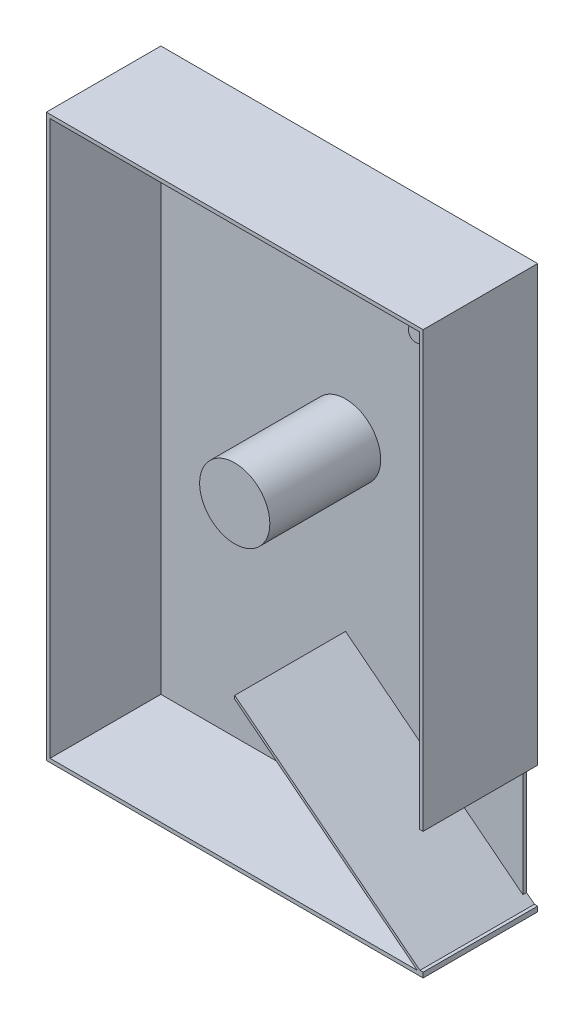
ISO-10303-21;
HEADER;
FILE_DESCRIPTION(('STEP AP214'),'2;1');
FILE_NAME('part.step','',(''),(''),'','','');
FILE_SCHEMA(('AUTOMOTIVE_DESIGN { 1 0 10303 214 1 1 1 1 }'));
ENDSEC;
DATA;
#1=APPLICATION_CONTEXT('core data for automotive mechanical design processes');
#2=APPLICATION_PROTOCOL_DEFINITION('international standard','automotive_design',2000,#1);
#3=PRODUCT_CONTEXT('',#1,'mechanical');
#4=PRODUCT('Part','Part','',(#3));
#5=PRODUCT_RELATED_PRODUCT_CATEGORY('part','',(#4));
#6=PRODUCT_DEFINITION_FORMATION('','',#4);
#7=PRODUCT_DEFINITION_CONTEXT('part definition',#1,'design');
#8=PRODUCT_DEFINITION('design','',#6,#7);
#9=PRODUCT_DEFINITION_SHAPE('','',#8);
#10=(LENGTH_UNIT() NAMED_UNIT(*) SI_UNIT(.MILLI.,.METRE.));
#11=(NAMED_UNIT(*) PLANE_ANGLE_UNIT() SI_UNIT($,.RADIAN.));
#12=(NAMED_UNIT(*) SI_UNIT($,.STERADIAN.) SOLID_ANGLE_UNIT());
#13=UNCERTAINTY_MEASURE_WITH_UNIT(LENGTH_MEASURE(1.E-05),#10,'distance_accuracy_value','');
#14=(GEOMETRIC_REPRESENTATION_CONTEXT(3) GLOBAL_UNCERTAINTY_ASSIGNED_CONTEXT((#13)) GLOBAL_UNIT_ASSIGNED_CONTEXT((#10,
#11,#12)) REPRESENTATION_CONTEXT('',''));
#15=CARTESIAN_POINT('',(0.,0.,0.));
#16=DIRECTION('',(0.,0.,1.));
#17=DIRECTION('',(1.,0.,0.));
#18=AXIS2_PLACEMENT_3D('',#15,#16,#17);
#19=CARTESIAN_POINT('',(48.0000000000001,-74.6402363837148,30.));
#20=DIRECTION('',(0.,-1.,0.));
#21=DIRECTION('',(1.,0.,0.));
#22=AXIS2_PLACEMENT_3D('',#19,#20,#21);
#23=PLANE('',#22);
#24=DIRECTION('',(1.,0.,0.));
#25=VECTOR('',#24,1.);
#26=CARTESIAN_POINT('',(48.0000000000001,-74.6402363837148,-1.00000000000001));
#27=LINE('',#26,#25);
#28=CARTESIAN_POINT('',(50.1349825437709,-74.6402363837148,-1.00000000000001));
#29=VERTEX_POINT('',#28);
#30=CARTESIAN_POINT('',(51.0000000000001,-74.6402363837148,-1.00000000000001));
#31=VERTEX_POINT('',#30);
#32=EDGE_CURVE('E235',#29,#31,#27,.T.);
#33=ORIENTED_EDGE('',*,*,#32,.F.);
#34=DIRECTION('',(0.,0.,1.));
#35=VECTOR('',#34,1.);
#36=CARTESIAN_POINT('',(50.1349825437709,-74.6402363837148,30.));
#37=LINE('',#36,#35);
#38=CARTESIAN_POINT('',(50.1349825437709,-74.6402363837149,30.));
#39=VERTEX_POINT('',#38);
#40=EDGE_CURVE('E207',#29,#39,#37,.T.);
#41=ORIENTED_EDGE('',*,*,#40,.T.);
#42=DIRECTION('',(1.,0.,0.));
#43=VECTOR('',#42,1.);
#44=CARTESIAN_POINT('',(48.0000000000001,-74.6402363837148,30.));
#45=LINE('',#44,#43);
#46=CARTESIAN_POINT('',(51.0000000000001,-74.6402363837148,30.));
#47=VERTEX_POINT('',#46);
#48=EDGE_CURVE('E222',#39,#47,#45,.T.);
#49=ORIENTED_EDGE('',*,*,#48,.T.);
#50=DIRECTION('',(0.,0.,-1.));
#51=VECTOR('',#50,1.);
#52=CARTESIAN_POINT('',(51.0000000000001,-74.6402363837148,30.));
#53=LINE('',#52,#51);
#54=EDGE_CURVE('E211',#47,#31,#53,.T.);
#55=ORIENTED_EDGE('',*,*,#54,.T.);
#56=EDGE_LOOP('',(#33,#41,#49,#55));
#57=FACE_BOUND('',#56,.T.);
#58=ADVANCED_FACE('F39',(#57),#23,.F.);
#59=CARTESIAN_POINT('',(48.0000000000001,0.,0.));
#60=DIRECTION('',(-1.,0.,0.));
#61=DIRECTION('',(0.,-1.,0.));
#62=AXIS2_PLACEMENT_3D('',#59,#60,#61);
#63=PLANE('',#62);
#64=DIRECTION('',(0.,-1.,0.));
#65=VECTOR('',#64,1.);
#66=CARTESIAN_POINT('',(48.0000000000001,-76.,0.));
#67=LINE('',#66,#65);
#68=CARTESIAN_POINT('',(48.0000000000001,-41.6222763175256,0.));
#69=VERTEX_POINT('',#68);
#70=CARTESIAN_POINT('',(48.0000000000001,-72.9621941872726,0.));
#71=VERTEX_POINT('',#70);
#72=EDGE_CURVE('E238',#69,#71,#67,.T.);
#73=ORIENTED_EDGE('',*,*,#72,.T.);
#74=DIRECTION('',(0.,0.,-1.));
#75=VECTOR('',#74,1.);
#76=CARTESIAN_POINT('',(48.0000000000001,-72.9621941872726,0.));
#77=LINE('',#76,#75);
#78=CARTESIAN_POINT('',(48.0000000000001,-72.9621941872726,-1.));
#79=VERTEX_POINT('',#78);
#80=EDGE_CURVE('E11',#71,#79,#77,.T.);
#81=ORIENTED_EDGE('',*,*,#80,.T.);
#82=DIRECTION('',(0.,1.,0.));
#83=VECTOR('',#82,1.);
#84=CARTESIAN_POINT('',(48.0000000000001,-74.6402363837148,-1.00000000000001));
#85=LINE('',#84,#83);
#86=CARTESIAN_POINT('',(48.0000000000001,-41.6222763175256,-1.00000000000001));
#87=VERTEX_POINT('',#86);
#88=EDGE_CURVE('E215',#79,#87,#85,.T.);
#89=ORIENTED_EDGE('',*,*,#88,.T.);
#90=DIRECTION('',(0.,0.,1.));
#91=VECTOR('',#90,1.);
#92=CARTESIAN_POINT('',(48.0000000000001,-41.6222763175256,30.));
#93=LINE('',#92,#91);
#94=EDGE_CURVE('E219',#87,#69,#93,.T.);
#95=ORIENTED_EDGE('',*,*,#94,.T.);
#96=EDGE_LOOP('',(#73,#81,#89,#95));
#97=FACE_BOUND('',#96,.T.);
#98=ADVANCED_FACE('F344',(#97),#63,.F.);
#99=CARTESIAN_POINT('',(51.,76.,30.));
#100=DIRECTION('',(-1.,0.,0.));
#101=DIRECTION('',(0.,-1.,0.));
#102=AXIS2_PLACEMENT_3D('',#99,#100,#101);
#103=PLANE('',#102);
#104=DIRECTION('',(0.,1.,0.));
#105=VECTOR('',#104,1.);
#106=CARTESIAN_POINT('',(51.,76.,30.));
#107=LINE('',#106,#105);
#108=CARTESIAN_POINT('',(51.0000000000001,-41.6222763175256,30.));
#109=VERTEX_POINT('',#108);
#110=CARTESIAN_POINT('',(51.,76.,30.));
#111=VERTEX_POINT('',#110);
#112=EDGE_CURVE('E298',#109,#111,#107,.T.);
#113=ORIENTED_EDGE('',*,*,#112,.F.);
#114=DIRECTION('',(0.,0.,1.));
#115=VECTOR('',#114,1.);
#116=CARTESIAN_POINT('',(51.0000000000001,-41.6222763175256,30.));
#117=LINE('',#116,#115);
#118=CARTESIAN_POINT('',(51.0000000000001,-41.6222763175256,-1.00000000000001));
#119=VERTEX_POINT('',#118);
#120=EDGE_CURVE('E216',#119,#109,#117,.T.);
#121=ORIENTED_EDGE('',*,*,#120,.F.);
#122=DIRECTION('',(0.,1.,0.));
#123=VECTOR('',#122,1.);
#124=CARTESIAN_POINT('',(51.,-76.,-1.00000000000001));
#125=LINE('',#124,#123);
#126=CARTESIAN_POINT('',(51.,76.,-1.00000000000001));
#127=VERTEX_POINT('',#126);
#128=EDGE_CURVE('E266',#119,#127,#125,.T.);
#129=ORIENTED_EDGE('',*,*,#128,.T.);
#130=DIRECTION('',(0.,0.,-1.));
#131=VECTOR('',#130,1.);
#132=CARTESIAN_POINT('',(51.,76.,30.));
#133=LINE('',#132,#131);
#134=EDGE_CURVE('E313',#111,#127,#133,.T.);
#135=ORIENTED_EDGE('',*,*,#134,.F.);
#136=EDGE_LOOP('',(#113,#121,#129,#135));
#137=FACE_BOUND('',#136,.T.);
#138=ADVANCED_FACE('F379',(#137),#103,.F.);
#139=CARTESIAN_POINT('',(50.,-75.,30.));
#140=DIRECTION('',(-1.,0.,0.));
#141=DIRECTION('',(0.,0.,1.));
#142=AXIS2_PLACEMENT_3D('',#139,#140,#141);
#143=PLANE('',#142);
#144=DIRECTION('',(0.,0.,-1.));
#145=VECTOR('',#144,1.);
#146=CARTESIAN_POINT('',(50.,-41.6222763175256,30.));
#147=LINE('',#146,#145);
#148=CARTESIAN_POINT('',(50.,-41.6222763175256,30.));
#149=VERTEX_POINT('',#148);
#150=CARTESIAN_POINT('',(50.,-41.6222763175256,0.));
#151=VERTEX_POINT('',#150);
#152=EDGE_CURVE('E246',#149,#151,#147,.T.);
#153=ORIENTED_EDGE('',*,*,#152,.F.);
#154=DIRECTION('',(0.,1.,0.));
#155=VECTOR('',#154,1.);
#156=CARTESIAN_POINT('',(50.,-75.,30.));
#157=LINE('',#156,#155);
#158=CARTESIAN_POINT('',(50.,75.,30.));
#159=VERTEX_POINT('',#158);
#160=EDGE_CURVE('E273',#149,#159,#157,.T.);
#161=ORIENTED_EDGE('',*,*,#160,.T.);
#162=DIRECTION('',(0.,0.,-1.));
#163=VECTOR('',#162,1.);
#164=CARTESIAN_POINT('',(50.,75.,30.));
#165=LINE('',#164,#163);
#166=CARTESIAN_POINT('',(50.,75.,0.));
#167=VERTEX_POINT('',#166);
#168=EDGE_CURVE('E295',#159,#167,#165,.T.);
#169=ORIENTED_EDGE('',*,*,#168,.T.);
#170=DIRECTION('',(0.,1.,0.));
#171=VECTOR('',#170,1.);
#172=CARTESIAN_POINT('',(50.,-75.,0.));
#173=LINE('',#172,#171);
#174=EDGE_CURVE('E270',#151,#167,#173,.T.);
#175=ORIENTED_EDGE('',*,*,#174,.F.);
#176=EDGE_LOOP('',(#153,#161,#169,#175));
#177=FACE_BOUND('',#176,.T.);
#178=ADVANCED_FACE('F352',(#177),#143,.T.);
#179=CARTESIAN_POINT('',(0.,0.,30.));
#180=DIRECTION('',(0.,0.,1.));
#181=DIRECTION('',(1.,0.,0.));
#182=AXIS2_PLACEMENT_3D('',#179,#180,#181);
#183=PLANE('',#182);
#184=CARTESIAN_POINT('',(51.0000000000001,-76.,30.));
#185=VERTEX_POINT('',#184);
#186=EDGE_CURVE('E299',#185,#47,#107,.T.);
#187=ORIENTED_EDGE('',*,*,#186,.T.);
#188=ORIENTED_EDGE('',*,*,#48,.F.);
#189=DIRECTION('',(-0.786218875910221,0.617948120122125,0.));
#190=VECTOR('',#189,1.);
#191=CARTESIAN_POINT('',(-17.1188589057721,-21.780420665576,30.));
#192=LINE('',#191,#190);
#193=CARTESIAN_POINT('',(0.,-35.235410113916,30.));
#194=VERTEX_POINT('',#193);
#195=EDGE_CURVE('E187',#39,#194,#192,.T.);
#196=ORIENTED_EDGE('',*,*,#195,.T.);
#197=DIRECTION('',(0.,-1.,0.));
#198=VECTOR('',#197,1.);
#199=CARTESIAN_POINT('',(0.,0.,30.));
#200=LINE('',#199,#198);
#201=CARTESIAN_POINT('',(0.,-36.1506167755202,30.));
#202=VERTEX_POINT('',#201);
#203=EDGE_CURVE('E175',#194,#202,#200,.T.);
#204=ORIENTED_EDGE('',*,*,#203,.T.);
#205=DIRECTION('',(0.786218875910221,-0.617948120122125,0.));
#206=VECTOR('',#205,1.);
#207=CARTESIAN_POINT('',(-17.5635051766391,-22.3461466219713,30.));
#208=LINE('',#207,#206);
#209=CARTESIAN_POINT('',(49.4282892268035,-75.,30.));
#210=VERTEX_POINT('',#209);
#211=EDGE_CURVE('E182',#202,#210,#208,.T.);
#212=ORIENTED_EDGE('',*,*,#211,.T.);
#213=DIRECTION('',(1.,0.,0.));
#214=VECTOR('',#213,1.);
#215=CARTESIAN_POINT('',(-50.,-75.,30.));
#216=LINE('',#215,#214);
#217=CARTESIAN_POINT('',(-50.,-75.,30.));
#218=VERTEX_POINT('',#217);
#219=EDGE_CURVE('E54',#218,#210,#216,.T.);
#220=ORIENTED_EDGE('',*,*,#219,.F.);
#221=DIRECTION('',(0.,-1.,0.));
#222=VECTOR('',#221,1.);
#223=CARTESIAN_POINT('',(-50.,-75.,30.));
#224=LINE('',#223,#222);
#225=CARTESIAN_POINT('',(-50.,75.,30.));
#226=VERTEX_POINT('',#225);
#227=EDGE_CURVE('E278',#226,#218,#224,.T.);
#228=ORIENTED_EDGE('',*,*,#227,.F.);
#229=DIRECTION('',(-1.,0.,0.));
#230=VECTOR('',#229,1.);
#231=CARTESIAN_POINT('',(-50.,75.,30.));
#232=LINE('',#231,#230);
#233=EDGE_CURVE('E275',#159,#226,#232,.T.);
#234=ORIENTED_EDGE('',*,*,#233,.F.);
#235=ORIENTED_EDGE('',*,*,#160,.F.);
#236=DIRECTION('',(1.,0.,0.));
#237=VECTOR('',#236,1.);
#238=CARTESIAN_POINT('',(48.0000000000001,-41.6222763175256,30.));
#239=LINE('',#238,#237);
#240=EDGE_CURVE('E226',#149,#109,#239,.T.);
#241=ORIENTED_EDGE('',*,*,#240,.T.);
#242=ORIENTED_EDGE('',*,*,#112,.T.);
#243=DIRECTION('',(-1.,0.,0.));
#244=VECTOR('',#243,1.);
#245=CARTESIAN_POINT('',(-50.9999999999999,76.,30.));
#246=LINE('',#245,#244);
#247=CARTESIAN_POINT('',(-50.9999999999999,76.,30.));
#248=VERTEX_POINT('',#247);
#249=EDGE_CURVE('E301',#111,#248,#246,.T.);
#250=ORIENTED_EDGE('',*,*,#249,.T.);
#251=DIRECTION('',(0.,-1.,0.));
#252=VECTOR('',#251,1.);
#253=CARTESIAN_POINT('',(-50.9999999999999,76.,30.));
#254=LINE('',#253,#252);
#255=CARTESIAN_POINT('',(-50.9999999999999,-76.,30.));
#256=VERTEX_POINT('',#255);
#257=EDGE_CURVE('E303',#248,#256,#254,.T.);
#258=ORIENTED_EDGE('',*,*,#257,.T.);
#259=DIRECTION('',(1.,0.,0.));
#260=VECTOR('',#259,1.);
#261=CARTESIAN_POINT('',(-50.9999999999999,-76.,30.));
#262=LINE('',#261,#260);
#263=EDGE_CURVE('E305',#256,#185,#262,.T.);
#264=ORIENTED_EDGE('',*,*,#263,.T.);
#265=EDGE_LOOP('',(#187,#188,#196,#204,#212,#220,#228,#234,#235,#241,#242,#250,#258,#264));
#266=FACE_BOUND('',#265,.T.);
#267=ADVANCED_FACE('F190',(#266),#183,.T.);
#268=CARTESIAN_POINT('',(51.,-76.,-1.00000000000001));
#269=VERTEX_POINT('',#268);
#270=EDGE_CURVE('E271',#269,#31,#125,.T.);
#271=ORIENTED_EDGE('',*,*,#270,.T.);
#272=ORIENTED_EDGE('',*,*,#54,.F.);
#273=ORIENTED_EDGE('',*,*,#186,.F.);
#274=DIRECTION('',(0.,0.,-1.));
#275=VECTOR('',#274,1.);
#276=CARTESIAN_POINT('',(51.0000000000001,-76.,30.));
#277=LINE('',#276,#275);
#278=EDGE_CURVE('E307',#185,#269,#277,.T.);
#279=ORIENTED_EDGE('',*,*,#278,.T.);
#280=EDGE_LOOP('',(#271,#272,#273,#279));
#281=FACE_BOUND('',#280,.T.);
#282=ADVANCED_FACE('F41',(#281),#103,.F.);
#283=CARTESIAN_POINT('',(-50.9999999999999,76.,30.));
#284=DIRECTION('',(0.,-1.,0.));
#285=DIRECTION('',(0.,0.,-1.));
#286=AXIS2_PLACEMENT_3D('',#283,#284,#285);
#287=PLANE('',#286);
#288=ORIENTED_EDGE('',*,*,#134,.T.);
#289=DIRECTION('',(-1.,0.,0.));
#290=VECTOR('',#289,1.);
#291=CARTESIAN_POINT('',(51.,76.,-1.00000000000001));
#292=LINE('',#291,#290);
#293=CARTESIAN_POINT('',(-50.9999999999999,76.,-1.));
#294=VERTEX_POINT('',#293);
#295=EDGE_CURVE('E258',#127,#294,#292,.T.);
#296=ORIENTED_EDGE('',*,*,#295,.T.);
#297=DIRECTION('',(0.,0.,-1.));
#298=VECTOR('',#297,1.);
#299=CARTESIAN_POINT('',(-50.9999999999999,76.,30.));
#300=LINE('',#299,#298);
#301=EDGE_CURVE('E311',#248,#294,#300,.T.);
#302=ORIENTED_EDGE('',*,*,#301,.F.);
#303=ORIENTED_EDGE('',*,*,#249,.F.);
#304=EDGE_LOOP('',(#288,#296,#302,#303));
#305=FACE_BOUND('',#304,.T.);
#306=ADVANCED_FACE('F495',(#305),#287,.F.);
#307=CARTESIAN_POINT('',(-50.9999999999999,76.,30.));
#308=DIRECTION('',(1.,0.,0.));
#309=DIRECTION('',(0.,1.,0.));
#310=AXIS2_PLACEMENT_3D('',#307,#308,#309);
#311=PLANE('',#310);
#312=ORIENTED_EDGE('',*,*,#301,.T.);
#313=DIRECTION('',(0.,1.,0.));
#314=VECTOR('',#313,1.);
#315=CARTESIAN_POINT('',(-50.9999999999999,-76.,-1.));
#316=LINE('',#315,#314);
#317=CARTESIAN_POINT('',(-50.9999999999999,-76.,-1.));
#318=VERTEX_POINT('',#317);
#319=EDGE_CURVE('E267',#318,#294,#316,.T.);
#320=ORIENTED_EDGE('',*,*,#319,.F.);
#321=DIRECTION('',(0.,0.,-1.));
#322=VECTOR('',#321,1.);
#323=CARTESIAN_POINT('',(-50.9999999999999,-76.,30.));
#324=LINE('',#323,#322);
#325=EDGE_CURVE('E309',#256,#318,#324,.T.);
#326=ORIENTED_EDGE('',*,*,#325,.F.);
#327=ORIENTED_EDGE('',*,*,#257,.F.);
#328=EDGE_LOOP('',(#312,#320,#326,#327));
#329=FACE_BOUND('',#328,.T.);
#330=ADVANCED_FACE('F502',(#329),#311,.F.);
#331=CARTESIAN_POINT('',(-50.9999999999999,-76.,30.));
#332=DIRECTION('',(0.,1.,0.));
#333=DIRECTION('',(0.,0.,1.));
#334=AXIS2_PLACEMENT_3D('',#331,#332,#333);
#335=PLANE('',#334);
#336=ORIENTED_EDGE('',*,*,#325,.T.);
#337=DIRECTION('',(-1.,0.,0.));
#338=VECTOR('',#337,1.);
#339=CARTESIAN_POINT('',(51.,-76.,-1.00000000000001));
#340=LINE('',#339,#338);
#341=EDGE_CURVE('E263',#269,#318,#340,.T.);
#342=ORIENTED_EDGE('',*,*,#341,.F.);
#343=ORIENTED_EDGE('',*,*,#278,.F.);
#344=ORIENTED_EDGE('',*,*,#263,.F.);
#345=EDGE_LOOP('',(#336,#342,#343,#344));
#346=FACE_BOUND('',#345,.T.);
#347=ADVANCED_FACE('F509',(#346),#335,.F.);
#348=CARTESIAN_POINT('',(-50.,75.,30.));
#349=DIRECTION('',(0.,-1.,0.));
#350=DIRECTION('',(0.,0.,-1.));
#351=AXIS2_PLACEMENT_3D('',#348,#349,#350);
#352=PLANE('',#351);
#353=DIRECTION('',(-1.,0.,0.));
#354=VECTOR('',#353,1.);
#355=CARTESIAN_POINT('',(-50.,75.,0.));
#356=LINE('',#355,#354);
#357=CARTESIAN_POINT('',(-50.,75.,0.));
#358=VERTEX_POINT('',#357);
#359=EDGE_CURVE('E284',#167,#358,#356,.T.);
#360=ORIENTED_EDGE('',*,*,#359,.F.);
#361=ORIENTED_EDGE('',*,*,#168,.F.);
#362=ORIENTED_EDGE('',*,*,#233,.T.);
#363=DIRECTION('',(0.,0.,-1.));
#364=VECTOR('',#363,1.);
#365=CARTESIAN_POINT('',(-50.,75.,30.));
#366=LINE('',#365,#364);
#367=EDGE_CURVE('E293',#226,#358,#366,.T.);
#368=ORIENTED_EDGE('',*,*,#367,.T.);
#369=EDGE_LOOP('',(#360,#361,#362,#368));
#370=FACE_BOUND('',#369,.T.);
#371=ADVANCED_FACE('F357',(#370),#352,.T.);
#372=CARTESIAN_POINT('',(-50.,-75.,30.));
#373=DIRECTION('',(1.,0.,0.));
#374=DIRECTION('',(0.,0.,-1.));
#375=AXIS2_PLACEMENT_3D('',#372,#373,#374);
#376=PLANE('',#375);
#377=DIRECTION('',(0.,-1.,0.));
#378=VECTOR('',#377,1.);
#379=CARTESIAN_POINT('',(-50.,-75.,0.));
#380=LINE('',#379,#378);
#381=CARTESIAN_POINT('',(-50.,-75.,0.));
#382=VERTEX_POINT('',#381);
#383=EDGE_CURVE('E287',#358,#382,#380,.T.);
#384=ORIENTED_EDGE('',*,*,#383,.F.);
#385=ORIENTED_EDGE('',*,*,#367,.F.);
#386=ORIENTED_EDGE('',*,*,#227,.T.);
#387=DIRECTION('',(0.,0.,-1.));
#388=VECTOR('',#387,1.);
#389=CARTESIAN_POINT('',(-50.,-75.,30.));
#390=LINE('',#389,#388);
#391=EDGE_CURVE('E282',#218,#382,#390,.T.);
#392=ORIENTED_EDGE('',*,*,#391,.T.);
#393=EDGE_LOOP('',(#384,#385,#386,#392));
#394=FACE_BOUND('',#393,.T.);
#395=ADVANCED_FACE('F362',(#394),#376,.T.);
#396=CARTESIAN_POINT('',(-50.,-75.,30.));
#397=DIRECTION('',(0.,1.,0.));
#398=DIRECTION('',(0.,0.,1.));
#399=AXIS2_PLACEMENT_3D('',#396,#397,#398);
#400=PLANE('',#399);
#401=DIRECTION('',(0.,0.,1.));
#402=VECTOR('',#401,1.);
#403=CARTESIAN_POINT('',(49.4282892268035,-75.,30.));
#404=LINE('',#403,#402);
#405=CARTESIAN_POINT('',(49.4282892268035,-75.,0.));
#406=VERTEX_POINT('',#405);
#407=EDGE_CURVE('E185',#406,#210,#404,.T.);
#408=ORIENTED_EDGE('',*,*,#407,.F.);
#409=DIRECTION('',(1.,0.,0.));
#410=VECTOR('',#409,1.);
#411=CARTESIAN_POINT('',(-50.,-75.,0.));
#412=LINE('',#411,#410);
#413=EDGE_CURVE('E276',#382,#406,#412,.T.);
#414=ORIENTED_EDGE('',*,*,#413,.F.);
#415=ORIENTED_EDGE('',*,*,#391,.F.);
#416=ORIENTED_EDGE('',*,*,#219,.T.);
#417=EDGE_LOOP('',(#408,#414,#415,#416));
#418=FACE_BOUND('',#417,.T.);
#419=ADVANCED_FACE('F364',(#418),#400,.T.);
#420=CARTESIAN_POINT('',(-50.9999999999999,-76.,0.));
#421=DIRECTION('',(0.,0.,1.));
#422=DIRECTION('',(1.,0.,0.));
#423=AXIS2_PLACEMENT_3D('',#420,#421,#422);
#424=PLANE('',#423);
#425=DIRECTION('',(-0.786218875910221,0.617948120122125,0.));
#426=VECTOR('',#425,1.);
#427=CARTESIAN_POINT('',(-11.719976864119,-26.0238051868878,0.));
#428=LINE('',#427,#426);
#429=CARTESIAN_POINT('',(0.,-35.235410113916,0.));
#430=VERTEX_POINT('',#429);
#431=EDGE_CURVE('E205',#71,#430,#428,.T.);
#432=ORIENTED_EDGE('',*,*,#431,.F.);
#433=ORIENTED_EDGE('',*,*,#72,.F.);
#434=DIRECTION('',(-1.,0.,0.));
#435=VECTOR('',#434,1.);
#436=CARTESIAN_POINT('',(-51.,-41.6222763175256,0.));
#437=LINE('',#436,#435);
#438=EDGE_CURVE('E244',#151,#69,#437,.T.);
#439=ORIENTED_EDGE('',*,*,#438,.F.);
#440=ORIENTED_EDGE('',*,*,#174,.T.);
#441=ORIENTED_EDGE('',*,*,#359,.T.);
#442=ORIENTED_EDGE('',*,*,#383,.T.);
#443=ORIENTED_EDGE('',*,*,#413,.T.);
#444=DIRECTION('',(0.786218875910221,-0.617948120122125,0.));
#445=VECTOR('',#444,1.);
#446=CARTESIAN_POINT('',(-12.1646231349861,-26.5895311432831,0.));
#447=LINE('',#446,#445);
#448=CARTESIAN_POINT('',(48.9705599502209,-74.6402363837148,0.));
#449=VERTEX_POINT('',#448);
#450=EDGE_CURVE('E202',#449,#406,#447,.T.);
#451=ORIENTED_EDGE('',*,*,#450,.F.);
#452=DIRECTION('',(1.,0.,0.));
#453=VECTOR('',#452,1.);
#454=CARTESIAN_POINT('',(-50.9999999999999,-74.6402363837149,0.));
#455=LINE('',#454,#453);
#456=CARTESIAN_POINT('',(48.0000000000001,-74.6402363837148,0.));
#457=VERTEX_POINT('',#456);
#458=EDGE_CURVE('E241',#457,#449,#455,.T.);
#459=ORIENTED_EDGE('',*,*,#458,.F.);
#460=CARTESIAN_POINT('',(48.0000000000001,-73.8774008488767,0.));
#461=VERTEX_POINT('',#460);
#462=EDGE_CURVE('E229',#461,#457,#67,.T.);
#463=ORIENTED_EDGE('',*,*,#462,.F.);
#464=CARTESIAN_POINT('',(0.,-36.1506167755202,0.));
#465=VERTEX_POINT('',#464);
#466=EDGE_CURVE('E198',#465,#461,#447,.T.);
#467=ORIENTED_EDGE('',*,*,#466,.F.);
#468=DIRECTION('',(0.,-1.,0.));
#469=VECTOR('',#468,1.);
#470=CARTESIAN_POINT('',(1.52655665885959E-13,-75.9999999999999,0.));
#471=LINE('',#470,#469);
#472=EDGE_CURVE('E62',#430,#465,#471,.T.);
#473=ORIENTED_EDGE('',*,*,#472,.F.);
#474=EDGE_LOOP('',(#432,#433,#439,#440,#441,#442,#443,#451,#459,#463,#467,#473));
#475=FACE_BOUND('',#474,.T.);
#476=CARTESIAN_POINT('',(34.,59.,0.));
#477=DIRECTION('',(0.,0.,1.));
#478=DIRECTION('',(1.,0.,0.));
#479=AXIS2_PLACEMENT_3D('',#476,#477,#478);
#480=CIRCLE('',#479,2.);
#481=CARTESIAN_POINT('',(36.,59.,0.));
#482=VERTEX_POINT('',#481);
#483=EDGE_CURVE('E248',#482,#482,#480,.T.);
#484=ORIENTED_EDGE('',*,*,#483,.F.);
#485=EDGE_LOOP('',(#484));
#486=FACE_BOUND('',#485,.T.);
#487=CARTESIAN_POINT('',(0.,9.76458988608398,0.));
#488=DIRECTION('',(0.,0.,1.));
#489=DIRECTION('',(1.,0.,0.));
#490=AXIS2_PLACEMENT_3D('',#487,#488,#489);
#491=CIRCLE('',#490,9.5);
#492=CARTESIAN_POINT('',(9.5,9.76458988608398,0.));
#493=VERTEX_POINT('',#492);
#494=EDGE_CURVE('E252',#493,#493,#491,.T.);
#495=ORIENTED_EDGE('',*,*,#494,.F.);
#496=EDGE_LOOP('',(#495));
#497=FACE_BOUND('',#496,.T.);
#498=ADVANCED_FACE('F324',(#475,#486,#497),#424,.T.);
#499=CARTESIAN_POINT('',(51.,-76.,-1.00000000000001));
#500=DIRECTION('',(0.,0.,-1.));
#501=DIRECTION('',(-1.,0.,0.));
#502=AXIS2_PLACEMENT_3D('',#499,#500,#501);
#503=PLANE('',#502);
#504=ORIENTED_EDGE('',*,*,#88,.F.);
#505=DIRECTION('',(-0.786218875910221,0.617948120122125,0.));
#506=VECTOR('',#505,1.);
#507=CARTESIAN_POINT('',(-17.1188589057721,-21.780420665576,-1.));
#508=LINE('',#507,#506);
#509=EDGE_CURVE('E179',#29,#79,#508,.T.);
#510=ORIENTED_EDGE('',*,*,#509,.F.);
#511=ORIENTED_EDGE('',*,*,#32,.T.);
#512=ORIENTED_EDGE('',*,*,#270,.F.);
#513=ORIENTED_EDGE('',*,*,#341,.T.);
#514=ORIENTED_EDGE('',*,*,#319,.T.);
#515=ORIENTED_EDGE('',*,*,#295,.F.);
#516=ORIENTED_EDGE('',*,*,#128,.F.);
#517=DIRECTION('',(1.,0.,0.));
#518=VECTOR('',#517,1.);
#519=CARTESIAN_POINT('',(48.0000000000001,-41.6222763175256,-1.00000000000001));
#520=LINE('',#519,#518);
#521=EDGE_CURVE('E230',#87,#119,#520,.T.);
#522=ORIENTED_EDGE('',*,*,#521,.F.);
#523=EDGE_LOOP('',(#504,#510,#511,#512,#513,#514,#515,#516,#522));
#524=FACE_BOUND('',#523,.T.);
#525=CARTESIAN_POINT('',(48.0000000000001,-74.6402363837148,-1.00000000000001));
#526=VERTEX_POINT('',#525);
#527=CARTESIAN_POINT('',(48.9705599502209,-74.6402363837148,-1.00000000000001));
#528=VERTEX_POINT('',#527);
#529=EDGE_CURVE('E232',#526,#528,#27,.T.);
#530=ORIENTED_EDGE('',*,*,#529,.T.);
#531=DIRECTION('',(0.786218875910221,-0.617948120122125,0.));
#532=VECTOR('',#531,1.);
#533=CARTESIAN_POINT('',(-17.5635051766391,-22.3461466219713,-1.));
#534=LINE('',#533,#532);
#535=CARTESIAN_POINT('',(48.0000000000001,-73.8774008488767,-1.00000000000001));
#536=VERTEX_POINT('',#535);
#537=EDGE_CURVE('E197',#536,#528,#534,.T.);
#538=ORIENTED_EDGE('',*,*,#537,.F.);
#539=EDGE_CURVE('E217',#526,#536,#85,.T.);
#540=ORIENTED_EDGE('',*,*,#539,.F.);
#541=EDGE_LOOP('',(#530,#538,#540));
#542=FACE_BOUND('',#541,.T.);
#543=ADVANCED_FACE('F338',(#524,#542),#503,.T.);
#544=CARTESIAN_POINT('',(0.,9.76458988608398,30.));
#545=DIRECTION('',(0.,0.,-1.));
#546=DIRECTION('',(-1.,0.,0.));
#547=AXIS2_PLACEMENT_3D('',#544,#545,#546);
#548=CYLINDRICAL_SURFACE('',#547,9.5);
#549=CARTESIAN_POINT('',(0.,9.76458988608398,30.));
#550=DIRECTION('',(0.,0.,1.));
#551=DIRECTION('',(1.,0.,0.));
#552=AXIS2_PLACEMENT_3D('',#549,#550,#551);
#553=CIRCLE('',#552,9.5);
#554=CARTESIAN_POINT('',(9.5,9.76458988608398,30.));
#555=VERTEX_POINT('',#554);
#556=EDGE_CURVE('E255',#555,#555,#553,.T.);
#557=ORIENTED_EDGE('',*,*,#556,.F.);
#558=EDGE_LOOP('',(#557));
#559=FACE_BOUND('',#558,.T.);
#560=ORIENTED_EDGE('',*,*,#494,.T.);
#561=EDGE_LOOP('',(#560));
#562=FACE_BOUND('',#561,.T.);
#563=ADVANCED_FACE('F428',(#559,#562),#548,.T.);
#564=CARTESIAN_POINT('',(0.,9.76458988608398,30.));
#565=DIRECTION('',(0.,0.,1.));
#566=DIRECTION('',(1.,0.,0.));
#567=AXIS2_PLACEMENT_3D('',#564,#565,#566);
#568=PLANE('',#567);
#569=ORIENTED_EDGE('',*,*,#556,.T.);
#570=EDGE_LOOP('',(#569));
#571=FACE_BOUND('',#570,.T.);
#572=ADVANCED_FACE('F537',(#571),#568,.T.);
#573=CARTESIAN_POINT('',(34.,59.,15.));
#574=DIRECTION('',(0.,0.,-1.));
#575=DIRECTION('',(-1.,0.,0.));
#576=AXIS2_PLACEMENT_3D('',#573,#574,#575);
#577=CYLINDRICAL_SURFACE('',#576,2.);
#578=CARTESIAN_POINT('',(34.,59.,15.));
#579=DIRECTION('',(0.,0.,1.));
#580=DIRECTION('',(1.,0.,0.));
#581=AXIS2_PLACEMENT_3D('',#578,#579,#580);
#582=CIRCLE('',#581,2.);
#583=CARTESIAN_POINT('',(36.,59.,15.));
#584=VERTEX_POINT('',#583);
#585=EDGE_CURVE('E249',#584,#584,#582,.T.);
#586=ORIENTED_EDGE('',*,*,#585,.F.);
#587=EDGE_LOOP('',(#586));
#588=FACE_BOUND('',#587,.T.);
#589=ORIENTED_EDGE('',*,*,#483,.T.);
#590=EDGE_LOOP('',(#589));
#591=FACE_BOUND('',#590,.T.);
#592=ADVANCED_FACE('F393',(#588,#591),#577,.T.);
#593=CARTESIAN_POINT('',(0.,0.,15.));
#594=DIRECTION('',(0.,0.,1.));
#595=DIRECTION('',(1.,0.,0.));
#596=AXIS2_PLACEMENT_3D('',#593,#594,#595);
#597=PLANE('',#596);
#598=ORIENTED_EDGE('',*,*,#585,.T.);
#599=EDGE_LOOP('',(#598));
#600=FACE_BOUND('',#599,.T.);
#601=ADVANCED_FACE('F389',(#600),#597,.T.);
#602=CARTESIAN_POINT('',(48.0000000000001,-41.6222763175256,30.));
#603=DIRECTION('',(0.,1.,0.));
#604=DIRECTION('',(-1.,0.,0.));
#605=AXIS2_PLACEMENT_3D('',#602,#603,#604);
#606=PLANE('',#605);
#607=ORIENTED_EDGE('',*,*,#152,.T.);
#608=ORIENTED_EDGE('',*,*,#438,.T.);
#609=ORIENTED_EDGE('',*,*,#94,.F.);
#610=ORIENTED_EDGE('',*,*,#521,.T.);
#611=ORIENTED_EDGE('',*,*,#120,.T.);
#612=ORIENTED_EDGE('',*,*,#240,.F.);
#613=EDGE_LOOP('',(#607,#608,#609,#610,#611,#612));
#614=FACE_BOUND('',#613,.T.);
#615=ADVANCED_FACE('F384',(#614),#606,.F.);
#616=ORIENTED_EDGE('',*,*,#458,.T.);
#617=DIRECTION('',(0.,0.,-1.));
#618=VECTOR('',#617,1.);
#619=CARTESIAN_POINT('',(48.9705599502209,-74.6402363837148,30.));
#620=LINE('',#619,#618);
#621=EDGE_CURVE('E201',#449,#528,#620,.T.);
#622=ORIENTED_EDGE('',*,*,#621,.T.);
#623=ORIENTED_EDGE('',*,*,#529,.F.);
#624=DIRECTION('',(0.,0.,-1.));
#625=VECTOR('',#624,1.);
#626=CARTESIAN_POINT('',(48.0000000000001,-74.6402363837148,30.));
#627=LINE('',#626,#625);
#628=EDGE_CURVE('E212',#457,#526,#627,.T.);
#629=ORIENTED_EDGE('',*,*,#628,.F.);
#630=EDGE_LOOP('',(#616,#622,#623,#629));
#631=FACE_BOUND('',#630,.T.);
#632=ADVANCED_FACE('F328',(#631),#23,.F.);
#633=ORIENTED_EDGE('',*,*,#539,.T.);
#634=DIRECTION('',(0.,0.,1.));
#635=VECTOR('',#634,1.);
#636=CARTESIAN_POINT('',(48.0000000000001,-73.8774008488767,0.));
#637=LINE('',#636,#635);
#638=EDGE_CURVE('E47',#536,#461,#637,.T.);
#639=ORIENTED_EDGE('',*,*,#638,.T.);
#640=ORIENTED_EDGE('',*,*,#462,.T.);
#641=ORIENTED_EDGE('',*,*,#628,.T.);
#642=EDGE_LOOP('',(#633,#639,#640,#641));
#643=FACE_BOUND('',#642,.T.);
#644=ADVANCED_FACE('F318',(#643),#63,.F.);
#645=CARTESIAN_POINT('',(-17.1188589057721,-21.780420665576,-1.));
#646=DIRECTION('',(0.617948120122125,0.786218875910221,0.));
#647=DIRECTION('',(-0.786218875910221,0.617948120122125,0.));
#648=AXIS2_PLACEMENT_3D('',#645,#646,#647);
#649=PLANE('',#648);
#650=ORIENTED_EDGE('',*,*,#40,.F.);
#651=ORIENTED_EDGE('',*,*,#509,.T.);
#652=ORIENTED_EDGE('',*,*,#80,.F.);
#653=ORIENTED_EDGE('',*,*,#431,.T.);
#654=DIRECTION('',(0.,0.,1.));
#655=VECTOR('',#654,1.);
#656=CARTESIAN_POINT('',(0.,-35.235410113916,-1.));
#657=LINE('',#656,#655);
#658=EDGE_CURVE('E178',#430,#194,#657,.T.);
#659=ORIENTED_EDGE('',*,*,#658,.T.);
#660=ORIENTED_EDGE('',*,*,#195,.F.);
#661=EDGE_LOOP('',(#650,#651,#652,#653,#659,#660));
#662=FACE_BOUND('',#661,.T.);
#663=ADVANCED_FACE('F335',(#662),#649,.T.);
#664=CARTESIAN_POINT('',(0.,0.,-1.));
#665=DIRECTION('',(-1.,0.,0.));
#666=DIRECTION('',(0.,-1.,0.));
#667=AXIS2_PLACEMENT_3D('',#664,#665,#666);
#668=PLANE('',#667);
#669=ORIENTED_EDGE('',*,*,#658,.F.);
#670=ORIENTED_EDGE('',*,*,#472,.T.);
#671=DIRECTION('',(0.,0.,1.));
#672=VECTOR('',#671,1.);
#673=CARTESIAN_POINT('',(0.,-36.1506167755202,-1.));
#674=LINE('',#673,#672);
#675=EDGE_CURVE('E170',#465,#202,#674,.T.);
#676=ORIENTED_EDGE('',*,*,#675,.T.);
#677=ORIENTED_EDGE('',*,*,#203,.F.);
#678=EDGE_LOOP('',(#669,#670,#676,#677));
#679=FACE_BOUND('',#678,.T.);
#680=ADVANCED_FACE('F173',(#679),#668,.T.);
#681=CARTESIAN_POINT('',(-17.5635051766391,-22.3461466219713,-1.));
#682=DIRECTION('',(-0.617948120122125,-0.786218875910221,0.));
#683=DIRECTION('',(0.786218875910221,-0.617948120122125,0.));
#684=AXIS2_PLACEMENT_3D('',#681,#682,#683);
#685=PLANE('',#684);
#686=ORIENTED_EDGE('',*,*,#450,.T.);
#687=ORIENTED_EDGE('',*,*,#407,.T.);
#688=ORIENTED_EDGE('',*,*,#211,.F.);
#689=ORIENTED_EDGE('',*,*,#675,.F.);
#690=ORIENTED_EDGE('',*,*,#466,.T.);
#691=ORIENTED_EDGE('',*,*,#638,.F.);
#692=ORIENTED_EDGE('',*,*,#537,.T.);
#693=ORIENTED_EDGE('',*,*,#621,.F.);
#694=EDGE_LOOP('',(#686,#687,#688,#689,#690,#691,#692,#693));
#695=FACE_BOUND('',#694,.T.);
#696=ADVANCED_FACE('F184',(#695),#685,.T.);
#697=CLOSED_SHELL('',(#58,#98,#138,#178,#267,#282,#306,#330,#347,#371,#395,#419,#498,#543,#563,
#572,#592,#601,#615,#632,#644,#663,#680,#696));
#698=MANIFOLD_SOLID_BREP('B2',#697);
#699=ADVANCED_BREP_SHAPE_REPRESENTATION('',(#18,#698),#14);
#700=SHAPE_DEFINITION_REPRESENTATION(#9,#699);
ENDSEC;
END-ISO-10303-21;
